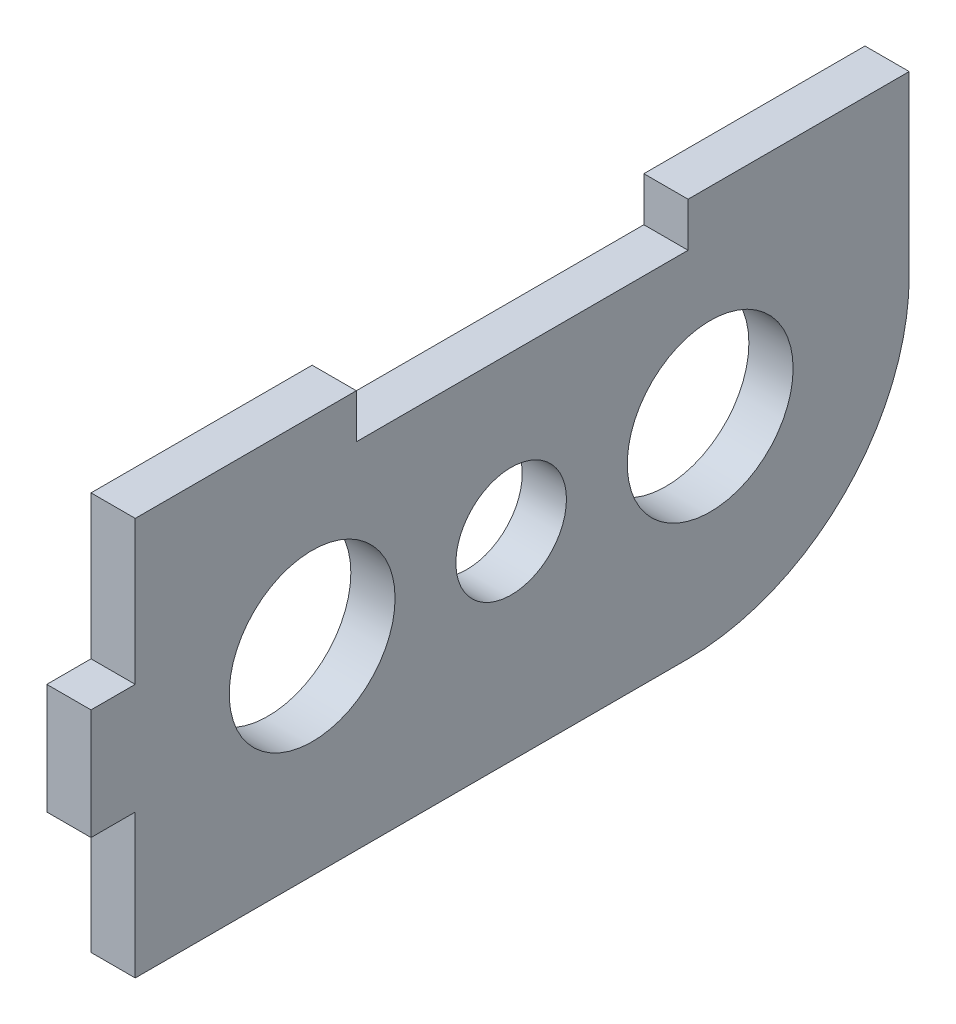
ISO-10303-21;
HEADER;
FILE_DESCRIPTION(('STEP AP214'),'2;1');
FILE_NAME('part.step','',(''),(''),'','','');
FILE_SCHEMA(('AUTOMOTIVE_DESIGN { 1 0 10303 214 1 1 1 1 }'));
ENDSEC;
DATA;
#1=APPLICATION_CONTEXT('core data for automotive mechanical design processes');
#2=APPLICATION_PROTOCOL_DEFINITION('international standard','automotive_design',2000,#1);
#3=PRODUCT_CONTEXT('',#1,'mechanical');
#4=PRODUCT('Part','Part','',(#3));
#5=PRODUCT_RELATED_PRODUCT_CATEGORY('part','',(#4));
#6=PRODUCT_DEFINITION_FORMATION('','',#4);
#7=PRODUCT_DEFINITION_CONTEXT('part definition',#1,'design');
#8=PRODUCT_DEFINITION('design','',#6,#7);
#9=PRODUCT_DEFINITION_SHAPE('','',#8);
#10=(LENGTH_UNIT() NAMED_UNIT(*) SI_UNIT(.MILLI.,.METRE.));
#11=(NAMED_UNIT(*) PLANE_ANGLE_UNIT() SI_UNIT($,.RADIAN.));
#12=(NAMED_UNIT(*) SI_UNIT($,.STERADIAN.) SOLID_ANGLE_UNIT());
#13=UNCERTAINTY_MEASURE_WITH_UNIT(LENGTH_MEASURE(1.E-05),#10,'distance_accuracy_value','');
#14=(GEOMETRIC_REPRESENTATION_CONTEXT(3) GLOBAL_UNCERTAINTY_ASSIGNED_CONTEXT((#13)) GLOBAL_UNIT_ASSIGNED_CONTEXT((#10,
#11,#12)) REPRESENTATION_CONTEXT('',''));
#15=CARTESIAN_POINT('',(0.,0.,0.));
#16=DIRECTION('',(0.,0.,1.));
#17=DIRECTION('',(1.,0.,0.));
#18=AXIS2_PLACEMENT_3D('',#15,#16,#17);
#19=CARTESIAN_POINT('',(4.,18.,-4.));
#20=DIRECTION('',(0.,-1.,0.));
#21=DIRECTION('',(0.,0.,-1.));
#22=AXIS2_PLACEMENT_3D('',#19,#20,#21);
#23=PLANE('',#22);
#24=DIRECTION('',(0.,0.,1.));
#25=VECTOR('',#24,1.);
#26=CARTESIAN_POINT('',(4.,18.,-4.));
#27=LINE('',#26,#25);
#28=CARTESIAN_POINT('',(4.,18.,-24.));
#29=VERTEX_POINT('',#28);
#30=CARTESIAN_POINT('',(4.,18.,-4.));
#31=VERTEX_POINT('',#30);
#32=EDGE_CURVE('E219',#29,#31,#27,.T.);
#33=ORIENTED_EDGE('',*,*,#32,.F.);
#34=DIRECTION('',(1.,0.,0.));
#35=VECTOR('',#34,1.);
#36=CARTESIAN_POINT('',(0.,18.,-24.));
#37=LINE('',#36,#35);
#38=CARTESIAN_POINT('',(0.,18.,-24.));
#39=VERTEX_POINT('',#38);
#40=EDGE_CURVE('E206',#39,#29,#37,.T.);
#41=ORIENTED_EDGE('',*,*,#40,.F.);
#42=DIRECTION('',(0.,0.,1.));
#43=VECTOR('',#42,1.);
#44=CARTESIAN_POINT('',(0.,18.,-4.));
#45=LINE('',#44,#43);
#46=CARTESIAN_POINT('',(0.,18.,-4.));
#47=VERTEX_POINT('',#46);
#48=EDGE_CURVE('E187',#39,#47,#45,.T.);
#49=ORIENTED_EDGE('',*,*,#48,.T.);
#50=DIRECTION('',(-1.,0.,0.));
#51=VECTOR('',#50,1.);
#52=CARTESIAN_POINT('',(4.,18.,-4.));
#53=LINE('',#52,#51);
#54=EDGE_CURVE('E286',#31,#47,#53,.T.);
#55=ORIENTED_EDGE('',*,*,#54,.F.);
#56=EDGE_LOOP('',(#33,#41,#49,#55));
#57=FACE_BOUND('',#56,.T.);
#58=ADVANCED_FACE('F43',(#57),#23,.F.);
#59=CARTESIAN_POINT('',(4.,18.,-74.));
#60=DIRECTION('',(0.,0.,1.));
#61=DIRECTION('',(1.,0.,0.));
#62=AXIS2_PLACEMENT_3D('',#59,#60,#61);
#63=PLANE('',#62);
#64=DIRECTION('',(0.,1.,0.));
#65=VECTOR('',#64,1.);
#66=CARTESIAN_POINT('',(4.,18.,-74.));
#67=LINE('',#66,#65);
#68=CARTESIAN_POINT('',(4.,2.,-74.));
#69=VERTEX_POINT('',#68);
#70=CARTESIAN_POINT('',(4.,18.,-74.));
#71=VERTEX_POINT('',#70);
#72=EDGE_CURVE('E216',#69,#71,#67,.T.);
#73=ORIENTED_EDGE('',*,*,#72,.F.);
#74=DIRECTION('',(-1.,0.,0.));
#75=VECTOR('',#74,1.);
#76=CARTESIAN_POINT('',(4.,2.,-74.));
#77=LINE('',#76,#75);
#78=CARTESIAN_POINT('',(0.,2.,-74.));
#79=VERTEX_POINT('',#78);
#80=EDGE_CURVE('E294',#69,#79,#77,.T.);
#81=ORIENTED_EDGE('',*,*,#80,.T.);
#82=DIRECTION('',(0.,1.,0.));
#83=VECTOR('',#82,1.);
#84=CARTESIAN_POINT('',(0.,18.,-74.));
#85=LINE('',#84,#83);
#86=CARTESIAN_POINT('',(0.,18.,-74.));
#87=VERTEX_POINT('',#86);
#88=EDGE_CURVE('E209',#79,#87,#85,.T.);
#89=ORIENTED_EDGE('',*,*,#88,.T.);
#90=DIRECTION('',(-1.,0.,0.));
#91=VECTOR('',#90,1.);
#92=CARTESIAN_POINT('',(4.,18.,-74.));
#93=LINE('',#92,#91);
#94=EDGE_CURVE('E290',#71,#87,#93,.T.);
#95=ORIENTED_EDGE('',*,*,#94,.F.);
#96=EDGE_LOOP('',(#73,#81,#89,#95));
#97=FACE_BOUND('',#96,.T.);
#98=ADVANCED_FACE('F355',(#97),#63,.F.);
#99=CARTESIAN_POINT('',(0.,18.,-54.));
#100=VERTEX_POINT('',#99);
#101=EDGE_CURVE('E246',#87,#100,#45,.T.);
#102=ORIENTED_EDGE('',*,*,#101,.T.);
#103=DIRECTION('',(1.,0.,0.));
#104=VECTOR('',#103,1.);
#105=CARTESIAN_POINT('',(0.,18.,-54.));
#106=LINE('',#105,#104);
#107=CARTESIAN_POINT('',(4.,18.,-54.));
#108=VERTEX_POINT('',#107);
#109=EDGE_CURVE('E210',#100,#108,#106,.T.);
#110=ORIENTED_EDGE('',*,*,#109,.T.);
#111=EDGE_CURVE('E221',#71,#108,#27,.T.);
#112=ORIENTED_EDGE('',*,*,#111,.F.);
#113=ORIENTED_EDGE('',*,*,#94,.T.);
#114=EDGE_LOOP('',(#102,#110,#112,#113));
#115=FACE_BOUND('',#114,.T.);
#116=ADVANCED_FACE('F360',(#115),#23,.F.);
#117=CARTESIAN_POINT('',(4.,5.,-4.));
#118=DIRECTION('',(0.,0.,-1.));
#119=DIRECTION('',(-1.,0.,0.));
#120=AXIS2_PLACEMENT_3D('',#117,#118,#119);
#121=PLANE('',#120);
#122=DIRECTION('',(0.,-1.,0.));
#123=VECTOR('',#122,1.);
#124=CARTESIAN_POINT('',(0.,5.,-4.));
#125=LINE('',#124,#123);
#126=CARTESIAN_POINT('',(0.,5.,-4.));
#127=VERTEX_POINT('',#126);
#128=EDGE_CURVE('E250',#47,#127,#125,.T.);
#129=ORIENTED_EDGE('',*,*,#128,.T.);
#130=DIRECTION('',(-1.,0.,0.));
#131=VECTOR('',#130,1.);
#132=CARTESIAN_POINT('',(4.,5.,-4.));
#133=LINE('',#132,#131);
#134=CARTESIAN_POINT('',(4.,5.,-4.));
#135=VERTEX_POINT('',#134);
#136=EDGE_CURVE('E282',#135,#127,#133,.T.);
#137=ORIENTED_EDGE('',*,*,#136,.F.);
#138=DIRECTION('',(0.,-1.,0.));
#139=VECTOR('',#138,1.);
#140=CARTESIAN_POINT('',(4.,5.,-4.));
#141=LINE('',#140,#139);
#142=EDGE_CURVE('E225',#31,#135,#141,.T.);
#143=ORIENTED_EDGE('',*,*,#142,.F.);
#144=ORIENTED_EDGE('',*,*,#54,.T.);
#145=EDGE_LOOP('',(#129,#137,#143,#144));
#146=FACE_BOUND('',#145,.T.);
#147=ADVANCED_FACE('F329',(#146),#121,.F.);
#148=CARTESIAN_POINT('',(4.,5.,0.));
#149=DIRECTION('',(0.,-1.,0.));
#150=DIRECTION('',(0.,0.,-1.));
#151=AXIS2_PLACEMENT_3D('',#148,#149,#150);
#152=PLANE('',#151);
#153=DIRECTION('',(0.,0.,1.));
#154=VECTOR('',#153,1.);
#155=CARTESIAN_POINT('',(0.,5.,0.));
#156=LINE('',#155,#154);
#157=CARTESIAN_POINT('',(0.,5.,0.));
#158=VERTEX_POINT('',#157);
#159=EDGE_CURVE('E253',#127,#158,#156,.T.);
#160=ORIENTED_EDGE('',*,*,#159,.T.);
#161=DIRECTION('',(-1.,0.,0.));
#162=VECTOR('',#161,1.);
#163=CARTESIAN_POINT('',(4.,5.,0.));
#164=LINE('',#163,#162);
#165=CARTESIAN_POINT('',(4.,5.,0.));
#166=VERTEX_POINT('',#165);
#167=EDGE_CURVE('E278',#166,#158,#164,.T.);
#168=ORIENTED_EDGE('',*,*,#167,.F.);
#169=DIRECTION('',(0.,0.,1.));
#170=VECTOR('',#169,1.);
#171=CARTESIAN_POINT('',(4.,5.,0.));
#172=LINE('',#171,#170);
#173=EDGE_CURVE('E228',#135,#166,#172,.T.);
#174=ORIENTED_EDGE('',*,*,#173,.F.);
#175=ORIENTED_EDGE('',*,*,#136,.T.);
#176=EDGE_LOOP('',(#160,#168,#174,#175));
#177=FACE_BOUND('',#176,.T.);
#178=ADVANCED_FACE('F334',(#177),#152,.F.);
#179=CARTESIAN_POINT('',(4.,-5.,0.));
#180=DIRECTION('',(0.,0.,-1.));
#181=DIRECTION('',(-1.,0.,0.));
#182=AXIS2_PLACEMENT_3D('',#179,#180,#181);
#183=PLANE('',#182);
#184=DIRECTION('',(0.,-1.,0.));
#185=VECTOR('',#184,1.);
#186=CARTESIAN_POINT('',(0.,-5.,0.));
#187=LINE('',#186,#185);
#188=CARTESIAN_POINT('',(0.,-5.,0.));
#189=VERTEX_POINT('',#188);
#190=EDGE_CURVE('E256',#158,#189,#187,.T.);
#191=ORIENTED_EDGE('',*,*,#190,.T.);
#192=DIRECTION('',(-1.,0.,0.));
#193=VECTOR('',#192,1.);
#194=CARTESIAN_POINT('',(4.,-5.,0.));
#195=LINE('',#194,#193);
#196=CARTESIAN_POINT('',(4.,-5.,0.));
#197=VERTEX_POINT('',#196);
#198=EDGE_CURVE('E274',#197,#189,#195,.T.);
#199=ORIENTED_EDGE('',*,*,#198,.F.);
#200=DIRECTION('',(0.,-1.,0.));
#201=VECTOR('',#200,1.);
#202=CARTESIAN_POINT('',(4.,-5.,0.));
#203=LINE('',#202,#201);
#204=EDGE_CURVE('E231',#166,#197,#203,.T.);
#205=ORIENTED_EDGE('',*,*,#204,.F.);
#206=ORIENTED_EDGE('',*,*,#167,.T.);
#207=EDGE_LOOP('',(#191,#199,#205,#206));
#208=FACE_BOUND('',#207,.T.);
#209=ADVANCED_FACE('F340',(#208),#183,.F.);
#210=CARTESIAN_POINT('',(4.,-5.,0.));
#211=DIRECTION('',(0.,1.,0.));
#212=DIRECTION('',(0.,0.,1.));
#213=AXIS2_PLACEMENT_3D('',#210,#211,#212);
#214=PLANE('',#213);
#215=DIRECTION('',(0.,0.,-1.));
#216=VECTOR('',#215,1.);
#217=CARTESIAN_POINT('',(0.,-5.,0.));
#218=LINE('',#217,#216);
#219=CARTESIAN_POINT('',(0.,-5.,-4.));
#220=VERTEX_POINT('',#219);
#221=EDGE_CURVE('E259',#189,#220,#218,.T.);
#222=ORIENTED_EDGE('',*,*,#221,.T.);
#223=DIRECTION('',(-1.,0.,0.));
#224=VECTOR('',#223,1.);
#225=CARTESIAN_POINT('',(4.,-5.,-4.));
#226=LINE('',#225,#224);
#227=CARTESIAN_POINT('',(4.,-5.,-4.));
#228=VERTEX_POINT('',#227);
#229=EDGE_CURVE('E270',#228,#220,#226,.T.);
#230=ORIENTED_EDGE('',*,*,#229,.F.);
#231=DIRECTION('',(0.,0.,-1.));
#232=VECTOR('',#231,1.);
#233=CARTESIAN_POINT('',(4.,-5.,0.));
#234=LINE('',#233,#232);
#235=EDGE_CURVE('E234',#197,#228,#234,.T.);
#236=ORIENTED_EDGE('',*,*,#235,.F.);
#237=ORIENTED_EDGE('',*,*,#198,.T.);
#238=EDGE_LOOP('',(#222,#230,#236,#237));
#239=FACE_BOUND('',#238,.T.);
#240=ADVANCED_FACE('F344',(#239),#214,.F.);
#241=CARTESIAN_POINT('',(4.,-5.,-4.));
#242=DIRECTION('',(0.,0.,-1.));
#243=DIRECTION('',(-1.,0.,0.));
#244=AXIS2_PLACEMENT_3D('',#241,#242,#243);
#245=PLANE('',#244);
#246=DIRECTION('',(0.,-1.,0.));
#247=VECTOR('',#246,1.);
#248=CARTESIAN_POINT('',(0.,-5.,-4.));
#249=LINE('',#248,#247);
#250=CARTESIAN_POINT('',(0.,-18.,-4.));
#251=VERTEX_POINT('',#250);
#252=EDGE_CURVE('E262',#220,#251,#249,.T.);
#253=ORIENTED_EDGE('',*,*,#252,.T.);
#254=DIRECTION('',(-1.,0.,0.));
#255=VECTOR('',#254,1.);
#256=CARTESIAN_POINT('',(4.,-18.,-4.));
#257=LINE('',#256,#255);
#258=CARTESIAN_POINT('',(4.,-18.,-4.));
#259=VERTEX_POINT('',#258);
#260=EDGE_CURVE('E243',#259,#251,#257,.T.);
#261=ORIENTED_EDGE('',*,*,#260,.F.);
#262=DIRECTION('',(0.,-1.,0.));
#263=VECTOR('',#262,1.);
#264=CARTESIAN_POINT('',(4.,-5.,-4.));
#265=LINE('',#264,#263);
#266=EDGE_CURVE('E237',#228,#259,#265,.T.);
#267=ORIENTED_EDGE('',*,*,#266,.F.);
#268=ORIENTED_EDGE('',*,*,#229,.T.);
#269=EDGE_LOOP('',(#253,#261,#267,#268));
#270=FACE_BOUND('',#269,.T.);
#271=ADVANCED_FACE('F349',(#270),#245,.F.);
#272=CARTESIAN_POINT('',(4.,-18.,-4.));
#273=DIRECTION('',(0.,1.,0.));
#274=DIRECTION('',(0.,0.,1.));
#275=AXIS2_PLACEMENT_3D('',#272,#273,#274);
#276=PLANE('',#275);
#277=DIRECTION('',(0.,0.,-1.));
#278=VECTOR('',#277,1.);
#279=CARTESIAN_POINT('',(0.,-18.,-4.));
#280=LINE('',#279,#278);
#281=CARTESIAN_POINT('',(0.,-18.,-54.));
#282=VERTEX_POINT('',#281);
#283=EDGE_CURVE('E220',#251,#282,#280,.T.);
#284=ORIENTED_EDGE('',*,*,#283,.T.);
#285=DIRECTION('',(-1.,0.,0.));
#286=VECTOR('',#285,1.);
#287=CARTESIAN_POINT('',(4.,-18.,-54.));
#288=LINE('',#287,#286);
#289=CARTESIAN_POINT('',(4.,-18.,-54.));
#290=VERTEX_POINT('',#289);
#291=EDGE_CURVE('E52',#282,#290,#288,.F.);
#292=ORIENTED_EDGE('',*,*,#291,.T.);
#293=DIRECTION('',(0.,0.,-1.));
#294=VECTOR('',#293,1.);
#295=CARTESIAN_POINT('',(4.,-18.,-4.));
#296=LINE('',#295,#294);
#297=EDGE_CURVE('E240',#259,#290,#296,.T.);
#298=ORIENTED_EDGE('',*,*,#297,.F.);
#299=ORIENTED_EDGE('',*,*,#260,.T.);
#300=EDGE_LOOP('',(#284,#292,#298,#299));
#301=FACE_BOUND('',#300,.T.);
#302=ADVANCED_FACE('F394',(#301),#276,.F.);
#303=CARTESIAN_POINT('',(4.,0.,0.));
#304=DIRECTION('',(1.,0.,0.));
#305=DIRECTION('',(0.,0.,-1.));
#306=AXIS2_PLACEMENT_3D('',#303,#304,#305);
#307=PLANE('',#306);
#308=CARTESIAN_POINT('',(4.,0.,-20.));
#309=DIRECTION('',(1.,0.,0.));
#310=DIRECTION('',(0.,0.,-1.));
#311=AXIS2_PLACEMENT_3D('',#308,#309,#310);
#312=CIRCLE('',#311,7.5);
#313=CARTESIAN_POINT('',(4.,0.,-27.5));
#314=VERTEX_POINT('',#313);
#315=EDGE_CURVE('E303',#314,#314,#312,.T.);
#316=ORIENTED_EDGE('',*,*,#315,.F.);
#317=EDGE_LOOP('',(#316));
#318=FACE_BOUND('',#317,.T.);
#319=CARTESIAN_POINT('',(4.,0.,-56.));
#320=DIRECTION('',(1.,0.,0.));
#321=DIRECTION('',(0.,0.,-1.));
#322=AXIS2_PLACEMENT_3D('',#319,#320,#321);
#323=CIRCLE('',#322,7.5);
#324=CARTESIAN_POINT('',(4.,0.,-63.5));
#325=VERTEX_POINT('',#324);
#326=EDGE_CURVE('E304',#325,#325,#323,.T.);
#327=ORIENTED_EDGE('',*,*,#326,.F.);
#328=EDGE_LOOP('',(#327));
#329=FACE_BOUND('',#328,.T.);
#330=CARTESIAN_POINT('',(4.,0.,-38.));
#331=DIRECTION('',(1.,0.,0.));
#332=DIRECTION('',(0.,0.,-1.));
#333=AXIS2_PLACEMENT_3D('',#330,#331,#332);
#334=CIRCLE('',#333,5.);
#335=CARTESIAN_POINT('',(4.,0.,-43.));
#336=VERTEX_POINT('',#335);
#337=EDGE_CURVE('E197',#336,#336,#334,.T.);
#338=ORIENTED_EDGE('',*,*,#337,.F.);
#339=EDGE_LOOP('',(#338));
#340=FACE_BOUND('',#339,.T.);
#341=ORIENTED_EDGE('',*,*,#297,.T.);
#342=CARTESIAN_POINT('',(4.,2.,-54.));
#343=DIRECTION('',(1.,0.,0.));
#344=DIRECTION('',(0.,0.,-1.));
#345=AXIS2_PLACEMENT_3D('',#342,#343,#344);
#346=CIRCLE('',#345,20.);
#347=EDGE_CURVE('E11',#290,#69,#346,.T.);
#348=ORIENTED_EDGE('',*,*,#347,.T.);
#349=ORIENTED_EDGE('',*,*,#72,.T.);
#350=ORIENTED_EDGE('',*,*,#111,.T.);
#351=DIRECTION('',(0.,1.,0.));
#352=VECTOR('',#351,1.);
#353=CARTESIAN_POINT('',(4.,18.,-54.));
#354=LINE('',#353,#352);
#355=CARTESIAN_POINT('',(4.,14.,-54.));
#356=VERTEX_POINT('',#355);
#357=EDGE_CURVE('E189',#356,#108,#354,.T.);
#358=ORIENTED_EDGE('',*,*,#357,.F.);
#359=DIRECTION('',(0.,0.,-1.));
#360=VECTOR('',#359,1.);
#361=CARTESIAN_POINT('',(4.,14.,-24.));
#362=LINE('',#361,#360);
#363=CARTESIAN_POINT('',(4.,14.,-24.));
#364=VERTEX_POINT('',#363);
#365=EDGE_CURVE('E194',#364,#356,#362,.T.);
#366=ORIENTED_EDGE('',*,*,#365,.F.);
#367=DIRECTION('',(0.,-1.,0.));
#368=VECTOR('',#367,1.);
#369=CARTESIAN_POINT('',(4.,18.,-24.));
#370=LINE('',#369,#368);
#371=EDGE_CURVE('E169',#29,#364,#370,.T.);
#372=ORIENTED_EDGE('',*,*,#371,.F.);
#373=ORIENTED_EDGE('',*,*,#32,.T.);
#374=ORIENTED_EDGE('',*,*,#142,.T.);
#375=ORIENTED_EDGE('',*,*,#173,.T.);
#376=ORIENTED_EDGE('',*,*,#204,.T.);
#377=ORIENTED_EDGE('',*,*,#235,.T.);
#378=ORIENTED_EDGE('',*,*,#266,.T.);
#379=EDGE_LOOP('',(#341,#348,#349,#350,#358,#366,#372,#373,#374,#375,#376,#377,#378));
#380=FACE_BOUND('',#379,.T.);
#381=ADVANCED_FACE('F324',(#318,#329,#340,#380),#307,.T.);
#382=CARTESIAN_POINT('',(0.,0.,0.));
#383=DIRECTION('',(1.,0.,0.));
#384=DIRECTION('',(0.,0.,-1.));
#385=AXIS2_PLACEMENT_3D('',#382,#383,#384);
#386=PLANE('',#385);
#387=CARTESIAN_POINT('',(0.,0.,-20.));
#388=DIRECTION('',(1.,0.,0.));
#389=DIRECTION('',(0.,0.,-1.));
#390=AXIS2_PLACEMENT_3D('',#387,#388,#389);
#391=CIRCLE('',#390,7.5);
#392=CARTESIAN_POINT('',(0.,0.,-27.5));
#393=VERTEX_POINT('',#392);
#394=EDGE_CURVE('E203',#393,#393,#391,.T.);
#395=ORIENTED_EDGE('',*,*,#394,.T.);
#396=EDGE_LOOP('',(#395));
#397=FACE_BOUND('',#396,.T.);
#398=CARTESIAN_POINT('',(0.,0.,-56.));
#399=DIRECTION('',(1.,0.,0.));
#400=DIRECTION('',(0.,0.,-1.));
#401=AXIS2_PLACEMENT_3D('',#398,#399,#400);
#402=CIRCLE('',#401,7.5);
#403=CARTESIAN_POINT('',(0.,0.,-63.5));
#404=VERTEX_POINT('',#403);
#405=EDGE_CURVE('E301',#404,#404,#402,.T.);
#406=ORIENTED_EDGE('',*,*,#405,.T.);
#407=EDGE_LOOP('',(#406));
#408=FACE_BOUND('',#407,.T.);
#409=CARTESIAN_POINT('',(0.,0.,-38.));
#410=DIRECTION('',(1.,0.,0.));
#411=DIRECTION('',(0.,0.,-1.));
#412=AXIS2_PLACEMENT_3D('',#409,#410,#411);
#413=CIRCLE('',#412,5.);
#414=CARTESIAN_POINT('',(0.,0.,-43.));
#415=VERTEX_POINT('',#414);
#416=EDGE_CURVE('E308',#415,#415,#413,.T.);
#417=ORIENTED_EDGE('',*,*,#416,.T.);
#418=EDGE_LOOP('',(#417));
#419=FACE_BOUND('',#418,.T.);
#420=ORIENTED_EDGE('',*,*,#88,.F.);
#421=CARTESIAN_POINT('',(0.,2.,-54.));
#422=DIRECTION('',(1.,0.,0.));
#423=DIRECTION('',(0.,0.,-1.));
#424=AXIS2_PLACEMENT_3D('',#421,#422,#423);
#425=CIRCLE('',#424,20.);
#426=EDGE_CURVE('E68',#79,#282,#425,.F.);
#427=ORIENTED_EDGE('',*,*,#426,.T.);
#428=ORIENTED_EDGE('',*,*,#283,.F.);
#429=ORIENTED_EDGE('',*,*,#252,.F.);
#430=ORIENTED_EDGE('',*,*,#221,.F.);
#431=ORIENTED_EDGE('',*,*,#190,.F.);
#432=ORIENTED_EDGE('',*,*,#159,.F.);
#433=ORIENTED_EDGE('',*,*,#128,.F.);
#434=ORIENTED_EDGE('',*,*,#48,.F.);
#435=DIRECTION('',(0.,-1.,0.));
#436=VECTOR('',#435,1.);
#437=CARTESIAN_POINT('',(0.,18.,-24.));
#438=LINE('',#437,#436);
#439=CARTESIAN_POINT('',(0.,14.,-24.));
#440=VERTEX_POINT('',#439);
#441=EDGE_CURVE('E166',#39,#440,#438,.T.);
#442=ORIENTED_EDGE('',*,*,#441,.T.);
#443=DIRECTION('',(0.,0.,-1.));
#444=VECTOR('',#443,1.);
#445=CARTESIAN_POINT('',(0.,14.,-24.));
#446=LINE('',#445,#444);
#447=CARTESIAN_POINT('',(0.,14.,-54.));
#448=VERTEX_POINT('',#447);
#449=EDGE_CURVE('E179',#440,#448,#446,.T.);
#450=ORIENTED_EDGE('',*,*,#449,.T.);
#451=DIRECTION('',(0.,1.,0.));
#452=VECTOR('',#451,1.);
#453=CARTESIAN_POINT('',(0.,18.,-54.));
#454=LINE('',#453,#452);
#455=EDGE_CURVE('E175',#448,#100,#454,.T.);
#456=ORIENTED_EDGE('',*,*,#455,.T.);
#457=ORIENTED_EDGE('',*,*,#101,.F.);
#458=EDGE_LOOP('',(#420,#427,#428,#429,#430,#431,#432,#433,#434,#442,#450,#456,#457));
#459=FACE_BOUND('',#458,.T.);
#460=ADVANCED_FACE('F185',(#397,#408,#419,#459),#386,.F.);
#461=CARTESIAN_POINT('',(0.,18.,-24.));
#462=DIRECTION('',(0.,0.,1.));
#463=DIRECTION('',(1.,0.,0.));
#464=AXIS2_PLACEMENT_3D('',#461,#462,#463);
#465=PLANE('',#464);
#466=ORIENTED_EDGE('',*,*,#371,.T.);
#467=DIRECTION('',(1.,0.,0.));
#468=VECTOR('',#467,1.);
#469=CARTESIAN_POINT('',(0.,14.,-24.));
#470=LINE('',#469,#468);
#471=EDGE_CURVE('E162',#440,#364,#470,.T.);
#472=ORIENTED_EDGE('',*,*,#471,.F.);
#473=ORIENTED_EDGE('',*,*,#441,.F.);
#474=ORIENTED_EDGE('',*,*,#40,.T.);
#475=EDGE_LOOP('',(#466,#472,#473,#474));
#476=FACE_BOUND('',#475,.T.);
#477=ADVANCED_FACE('F164',(#476),#465,.F.);
#478=CARTESIAN_POINT('',(0.,18.,-54.));
#479=DIRECTION('',(0.,0.,-1.));
#480=DIRECTION('',(0.,1.,0.));
#481=AXIS2_PLACEMENT_3D('',#478,#479,#480);
#482=PLANE('',#481);
#483=ORIENTED_EDGE('',*,*,#357,.T.);
#484=ORIENTED_EDGE('',*,*,#109,.F.);
#485=ORIENTED_EDGE('',*,*,#455,.F.);
#486=DIRECTION('',(1.,0.,0.));
#487=VECTOR('',#486,1.);
#488=CARTESIAN_POINT('',(0.,14.,-54.));
#489=LINE('',#488,#487);
#490=EDGE_CURVE('E174',#448,#356,#489,.T.);
#491=ORIENTED_EDGE('',*,*,#490,.T.);
#492=EDGE_LOOP('',(#483,#484,#485,#491));
#493=FACE_BOUND('',#492,.T.);
#494=ADVANCED_FACE('F363',(#493),#482,.F.);
#495=CARTESIAN_POINT('',(0.,14.,-24.));
#496=DIRECTION('',(0.,-1.,0.));
#497=DIRECTION('',(0.,0.,-1.));
#498=AXIS2_PLACEMENT_3D('',#495,#496,#497);
#499=PLANE('',#498);
#500=ORIENTED_EDGE('',*,*,#365,.T.);
#501=ORIENTED_EDGE('',*,*,#490,.F.);
#502=ORIENTED_EDGE('',*,*,#449,.F.);
#503=ORIENTED_EDGE('',*,*,#471,.T.);
#504=EDGE_LOOP('',(#500,#501,#502,#503));
#505=FACE_BOUND('',#504,.T.);
#506=ADVANCED_FACE('F180',(#505),#499,.F.);
#507=CARTESIAN_POINT('',(4.,2.,-54.));
#508=DIRECTION('',(-1.,0.,0.));
#509=DIRECTION('',(0.,0.,1.));
#510=AXIS2_PLACEMENT_3D('',#507,#508,#509);
#511=CYLINDRICAL_SURFACE('',#510,20.);
#512=ORIENTED_EDGE('',*,*,#347,.F.);
#513=ORIENTED_EDGE('',*,*,#291,.F.);
#514=ORIENTED_EDGE('',*,*,#426,.F.);
#515=ORIENTED_EDGE('',*,*,#80,.F.);
#516=EDGE_LOOP('',(#512,#513,#514,#515));
#517=FACE_BOUND('',#516,.T.);
#518=ADVANCED_FACE('F45',(#517),#511,.T.);
#519=CARTESIAN_POINT('',(0.,0.,-38.));
#520=DIRECTION('',(1.,0.,0.));
#521=DIRECTION('',(0.,0.,-1.));
#522=AXIS2_PLACEMENT_3D('',#519,#520,#521);
#523=CYLINDRICAL_SURFACE('',#522,5.);
#524=ORIENTED_EDGE('',*,*,#416,.F.);
#525=EDGE_LOOP('',(#524));
#526=FACE_BOUND('',#525,.T.);
#527=ORIENTED_EDGE('',*,*,#337,.T.);
#528=EDGE_LOOP('',(#527));
#529=FACE_BOUND('',#528,.T.);
#530=ADVANCED_FACE('F410',(#526,#529),#523,.F.);
#531=CARTESIAN_POINT('',(0.,0.,-56.));
#532=DIRECTION('',(1.,0.,0.));
#533=DIRECTION('',(0.,0.,-1.));
#534=AXIS2_PLACEMENT_3D('',#531,#532,#533);
#535=CYLINDRICAL_SURFACE('',#534,7.5);
#536=ORIENTED_EDGE('',*,*,#405,.F.);
#537=EDGE_LOOP('',(#536));
#538=FACE_BOUND('',#537,.T.);
#539=ORIENTED_EDGE('',*,*,#326,.T.);
#540=EDGE_LOOP('',(#539));
#541=FACE_BOUND('',#540,.T.);
#542=ADVANCED_FACE('F412',(#538,#541),#535,.F.);
#543=CARTESIAN_POINT('',(0.,0.,-20.));
#544=DIRECTION('',(1.,0.,0.));
#545=DIRECTION('',(0.,0.,-1.));
#546=AXIS2_PLACEMENT_3D('',#543,#544,#545);
#547=CYLINDRICAL_SURFACE('',#546,7.5);
#548=ORIENTED_EDGE('',*,*,#394,.F.);
#549=EDGE_LOOP('',(#548));
#550=FACE_BOUND('',#549,.T.);
#551=ORIENTED_EDGE('',*,*,#315,.T.);
#552=EDGE_LOOP('',(#551));
#553=FACE_BOUND('',#552,.T.);
#554=ADVANCED_FACE('F418',(#550,#553),#547,.F.);
#555=CLOSED_SHELL('',(#58,#98,#116,#147,#178,#209,#240,#271,#302,#381,#460,#477,#494,#506,#518,
#530,#542,#554));
#556=MANIFOLD_SOLID_BREP('B2',#555);
#557=ADVANCED_BREP_SHAPE_REPRESENTATION('',(#18,#556),#14);
#558=SHAPE_DEFINITION_REPRESENTATION(#9,#557);
ENDSEC;
END-ISO-10303-21;
